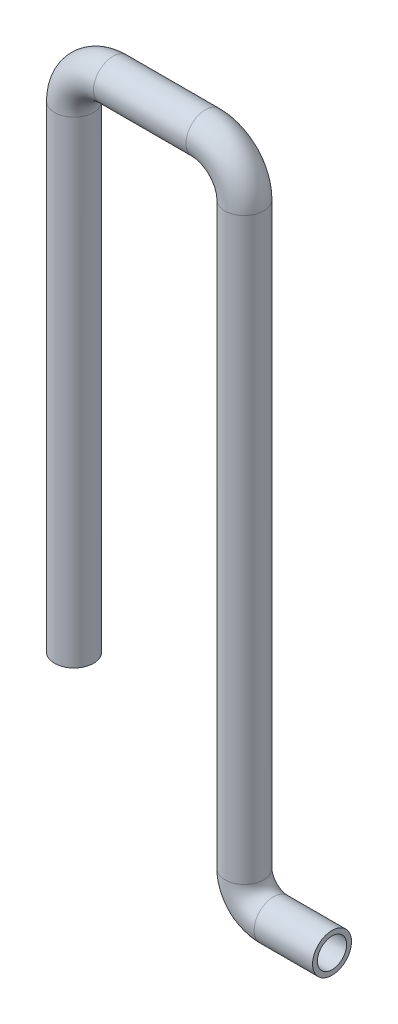
ISO-10303-21;
HEADER;
FILE_DESCRIPTION(('STEP AP214'),'2;1');
FILE_NAME('part.step','',(''),(''),'','','');
FILE_SCHEMA(('AUTOMOTIVE_DESIGN { 1 0 10303 214 1 1 1 1 }'));
ENDSEC;
DATA;
#1=APPLICATION_CONTEXT('core data for automotive mechanical design processes');
#2=APPLICATION_PROTOCOL_DEFINITION('international standard','automotive_design',2000,#1);
#3=PRODUCT_CONTEXT('',#1,'mechanical');
#4=PRODUCT('Part','Part','',(#3));
#5=PRODUCT_RELATED_PRODUCT_CATEGORY('part','',(#4));
#6=PRODUCT_DEFINITION_FORMATION('','',#4);
#7=PRODUCT_DEFINITION_CONTEXT('part definition',#1,'design');
#8=PRODUCT_DEFINITION('design','',#6,#7);
#9=PRODUCT_DEFINITION_SHAPE('','',#8);
#10=(LENGTH_UNIT() NAMED_UNIT(*) SI_UNIT(.MILLI.,.METRE.));
#11=(NAMED_UNIT(*) PLANE_ANGLE_UNIT() SI_UNIT($,.RADIAN.));
#12=(NAMED_UNIT(*) SI_UNIT($,.STERADIAN.) SOLID_ANGLE_UNIT());
#13=UNCERTAINTY_MEASURE_WITH_UNIT(LENGTH_MEASURE(1.E-05),#10,'distance_accuracy_value','');
#14=(GEOMETRIC_REPRESENTATION_CONTEXT(3) GLOBAL_UNCERTAINTY_ASSIGNED_CONTEXT((#13)) GLOBAL_UNIT_ASSIGNED_CONTEXT((#10,
#11,#12)) REPRESENTATION_CONTEXT('',''));
#15=CARTESIAN_POINT('',(0.,0.,0.));
#16=DIRECTION('',(0.,0.,1.));
#17=DIRECTION('',(1.,0.,0.));
#18=AXIS2_PLACEMENT_3D('',#15,#16,#17);
#19=CARTESIAN_POINT('',(-145.,44.,95.));
#20=DIRECTION('',(0.,-1.,0.));
#21=DIRECTION('',(0.,0.,1.));
#22=AXIS2_PLACEMENT_3D('',#19,#20,#21);
#23=PLANE('',#22);
#24=CARTESIAN_POINT('',(-145.,44.,95.));
#25=DIRECTION('',(0.,-1.,0.));
#26=DIRECTION('',(0.,0.,1.));
#27=AXIS2_PLACEMENT_3D('',#24,#25,#26);
#28=CIRCLE('',#27,3.);
#29=CARTESIAN_POINT('',(-145.,44.,98.));
#30=VERTEX_POINT('',#29);
#31=EDGE_CURVE('E263',#30,#30,#28,.T.);
#32=ORIENTED_EDGE('',*,*,#31,.F.);
#33=EDGE_LOOP('',(#32));
#34=FACE_BOUND('',#33,.T.);
#35=CARTESIAN_POINT('',(-145.,44.,95.));
#36=DIRECTION('',(0.,-1.,0.));
#37=DIRECTION('',(0.,0.,-1.));
#38=AXIS2_PLACEMENT_3D('',#35,#36,#37);
#39=CIRCLE('',#38,4.);
#40=CARTESIAN_POINT('',(-145.,44.,91.));
#41=VERTEX_POINT('',#40);
#42=EDGE_CURVE('E75',#41,#41,#39,.T.);
#43=ORIENTED_EDGE('',*,*,#42,.T.);
#44=EDGE_LOOP('',(#43));
#45=FACE_BOUND('',#44,.T.);
#46=ADVANCED_FACE('F52',(#34,#45),#23,.T.);
#47=CARTESIAN_POINT('',(-92.,17.,95.));
#48=DIRECTION('',(-1.,0.,0.));
#49=DIRECTION('',(0.,0.,1.));
#50=AXIS2_PLACEMENT_3D('',#47,#48,#49);
#51=PLANE('',#50);
#52=CARTESIAN_POINT('',(-92.,17.,95.));
#53=DIRECTION('',(-1.,0.,0.));
#54=DIRECTION('',(0.,0.,1.));
#55=AXIS2_PLACEMENT_3D('',#52,#53,#54);
#56=CIRCLE('',#55,3.);
#57=CARTESIAN_POINT('',(-92.,17.,98.));
#58=VERTEX_POINT('',#57);
#59=EDGE_CURVE('E73',#58,#58,#56,.T.);
#60=ORIENTED_EDGE('',*,*,#59,.T.);
#61=EDGE_LOOP('',(#60));
#62=FACE_BOUND('',#61,.T.);
#63=CARTESIAN_POINT('',(-92.,17.,95.));
#64=DIRECTION('',(-1.,0.,0.));
#65=DIRECTION('',(0.,0.,1.));
#66=AXIS2_PLACEMENT_3D('',#63,#64,#65);
#67=CIRCLE('',#66,4.);
#68=CARTESIAN_POINT('',(-92.,17.,99.));
#69=VERTEX_POINT('',#68);
#70=EDGE_CURVE('E11',#69,#69,#67,.T.);
#71=ORIENTED_EDGE('',*,*,#70,.F.);
#72=EDGE_LOOP('',(#71));
#73=FACE_BOUND('',#72,.T.);
#74=ADVANCED_FACE('F149',(#62,#73),#51,.F.);
#75=CARTESIAN_POINT('',(-145.,44.,95.));
#76=DIRECTION('',(0.,1.,0.));
#77=DIRECTION('',(0.,0.,1.));
#78=AXIS2_PLACEMENT_3D('',#75,#76,#77);
#79=CYLINDRICAL_SURFACE('',#78,4.);
#80=CARTESIAN_POINT('',(-145.,142.,95.));
#81=DIRECTION('',(0.,1.,0.));
#82=DIRECTION('',(0.,0.,1.));
#83=AXIS2_PLACEMENT_3D('',#80,#81,#82);
#84=CIRCLE('',#83,4.);
#85=CARTESIAN_POINT('',(-149.,142.,95.));
#86=VERTEX_POINT('',#85);
#87=EDGE_CURVE('E74',#86,#86,#84,.F.);
#88=ORIENTED_EDGE('',*,*,#87,.T.);
#89=EDGE_LOOP('',(#88));
#90=FACE_BOUND('',#89,.T.);
#91=ORIENTED_EDGE('',*,*,#42,.F.);
#92=EDGE_LOOP('',(#91));
#93=FACE_BOUND('',#92,.T.);
#94=ADVANCED_FACE('F155',(#90,#93),#79,.T.);
#95=CARTESIAN_POINT('',(-137.,142.,95.));
#96=DIRECTION('',(0.,0.,-1.));
#97=DIRECTION('',(-1.,0.,0.));
#98=AXIS2_PLACEMENT_3D('',#95,#96,#97);
#99=TOROIDAL_SURFACE('',#98,8.00000000000001,4.);
#100=CARTESIAN_POINT('',(-137.,150.,95.));
#101=DIRECTION('',(-1.,0.,0.));
#102=DIRECTION('',(0.,-1.,0.));
#103=AXIS2_PLACEMENT_3D('',#100,#101,#102);
#104=CIRCLE('',#103,4.);
#105=CARTESIAN_POINT('',(-137.,154.,95.));
#106=VERTEX_POINT('',#105);
#107=EDGE_CURVE('E78',#106,#106,#104,.T.);
#108=CARTESIAN_POINT('',(-137.,142.,95.));
#109=DIRECTION('',(0.,0.,-1.));
#110=DIRECTION('',(-1.,0.,0.));
#111=AXIS2_PLACEMENT_3D('',#108,#109,#110);
#112=CIRCLE('',#111,12.);
#113=EDGE_CURVE('',#86,#106,#112,.T.);
#114=ORIENTED_EDGE('',*,*,#87,.F.);
#115=ORIENTED_EDGE('',*,*,#107,.T.);
#116=ORIENTED_EDGE('',*,*,#113,.T.);
#117=ORIENTED_EDGE('',*,*,#113,.F.);
#118=EDGE_LOOP('',(#114,#116,#115,#117));
#119=FACE_BOUND('',#118,.T.);
#120=ADVANCED_FACE('F158',(#119),#99,.T.);
#121=CARTESIAN_POINT('',(-137.,150.,95.));
#122=DIRECTION('',(1.,0.,0.));
#123=DIRECTION('',(0.,0.,-1.));
#124=AXIS2_PLACEMENT_3D('',#121,#122,#123);
#125=CYLINDRICAL_SURFACE('',#124,4.);
#126=CARTESIAN_POINT('',(-118.,150.,95.));
#127=DIRECTION('',(1.,0.,0.));
#128=DIRECTION('',(0.,0.,-1.));
#129=AXIS2_PLACEMENT_3D('',#126,#127,#128);
#130=CIRCLE('',#129,4.);
#131=CARTESIAN_POINT('',(-118.,154.,95.));
#132=VERTEX_POINT('',#131);
#133=EDGE_CURVE('E91',#132,#132,#130,.F.);
#134=ORIENTED_EDGE('',*,*,#133,.T.);
#135=EDGE_LOOP('',(#134));
#136=FACE_BOUND('',#135,.T.);
#137=ORIENTED_EDGE('',*,*,#107,.F.);
#138=EDGE_LOOP('',(#137));
#139=FACE_BOUND('',#138,.T.);
#140=ADVANCED_FACE('F109',(#136,#139),#125,.T.);
#141=CARTESIAN_POINT('',(-118.,142.,95.));
#142=DIRECTION('',(0.,0.,-1.));
#143=DIRECTION('',(-1.,0.,0.));
#144=AXIS2_PLACEMENT_3D('',#141,#142,#143);
#145=TOROIDAL_SURFACE('',#144,8.00000000000015,4.);
#146=CARTESIAN_POINT('',(-110.,142.,95.));
#147=DIRECTION('',(0.,1.,0.));
#148=DIRECTION('',(-1.,0.,0.));
#149=AXIS2_PLACEMENT_3D('',#146,#147,#148);
#150=CIRCLE('',#149,4.);
#151=CARTESIAN_POINT('',(-106.,142.,95.));
#152=VERTEX_POINT('',#151);
#153=EDGE_CURVE('E68',#152,#152,#150,.T.);
#154=CARTESIAN_POINT('',(-118.,142.,95.));
#155=DIRECTION('',(0.,0.,-1.));
#156=DIRECTION('',(-1.,0.,0.));
#157=AXIS2_PLACEMENT_3D('',#154,#155,#156);
#158=CIRCLE('',#157,12.0000000000001);
#159=EDGE_CURVE('',#132,#152,#158,.T.);
#160=ORIENTED_EDGE('',*,*,#133,.F.);
#161=ORIENTED_EDGE('',*,*,#153,.T.);
#162=ORIENTED_EDGE('',*,*,#159,.T.);
#163=ORIENTED_EDGE('',*,*,#159,.F.);
#164=EDGE_LOOP('',(#160,#162,#161,#163));
#165=FACE_BOUND('',#164,.T.);
#166=ADVANCED_FACE('F98',(#165),#145,.T.);
#167=CARTESIAN_POINT('',(-110.,142.,95.));
#168=DIRECTION('',(0.,-1.,0.));
#169=DIRECTION('',(0.,0.,-1.));
#170=AXIS2_PLACEMENT_3D('',#167,#168,#169);
#171=CYLINDRICAL_SURFACE('',#170,4.);
#172=CARTESIAN_POINT('',(-110.,23.,95.));
#173=DIRECTION('',(0.,-1.,0.));
#174=DIRECTION('',(0.,0.,-1.));
#175=AXIS2_PLACEMENT_3D('',#172,#173,#174);
#176=CIRCLE('',#175,4.);
#177=CARTESIAN_POINT('',(-114.,23.,95.));
#178=VERTEX_POINT('',#177);
#179=EDGE_CURVE('E63',#178,#178,#176,.F.);
#180=ORIENTED_EDGE('',*,*,#179,.T.);
#181=EDGE_LOOP('',(#180));
#182=FACE_BOUND('',#181,.T.);
#183=ORIENTED_EDGE('',*,*,#153,.F.);
#184=EDGE_LOOP('',(#183));
#185=FACE_BOUND('',#184,.T.);
#186=ADVANCED_FACE('F101',(#182,#185),#171,.T.);
#187=CARTESIAN_POINT('',(-104.,23.,95.));
#188=DIRECTION('',(0.,0.,1.));
#189=DIRECTION('',(1.,0.,0.));
#190=AXIS2_PLACEMENT_3D('',#187,#188,#189);
#191=TOROIDAL_SURFACE('',#190,6.00000000000002,4.);
#192=CARTESIAN_POINT('',(-104.,17.,95.));
#193=DIRECTION('',(-1.,0.,0.));
#194=DIRECTION('',(0.,-1.,0.));
#195=AXIS2_PLACEMENT_3D('',#192,#193,#194);
#196=CIRCLE('',#195,4.);
#197=CARTESIAN_POINT('',(-104.,13.,95.));
#198=VERTEX_POINT('',#197);
#199=EDGE_CURVE('E58',#198,#198,#196,.T.);
#200=CARTESIAN_POINT('',(-104.,23.,95.));
#201=DIRECTION('',(0.,0.,1.));
#202=DIRECTION('',(1.,0.,0.));
#203=AXIS2_PLACEMENT_3D('',#200,#201,#202);
#204=CIRCLE('',#203,10.);
#205=EDGE_CURVE('',#178,#198,#204,.T.);
#206=ORIENTED_EDGE('',*,*,#179,.F.);
#207=ORIENTED_EDGE('',*,*,#199,.T.);
#208=ORIENTED_EDGE('',*,*,#205,.T.);
#209=ORIENTED_EDGE('',*,*,#205,.F.);
#210=EDGE_LOOP('',(#206,#208,#207,#209));
#211=FACE_BOUND('',#210,.T.);
#212=ADVANCED_FACE('F103',(#211),#191,.T.);
#213=CARTESIAN_POINT('',(-104.,17.,95.));
#214=DIRECTION('',(1.,0.,0.));
#215=DIRECTION('',(0.,0.,-1.));
#216=AXIS2_PLACEMENT_3D('',#213,#214,#215);
#217=CYLINDRICAL_SURFACE('',#216,4.);
#218=ORIENTED_EDGE('',*,*,#70,.T.);
#219=EDGE_LOOP('',(#218));
#220=FACE_BOUND('',#219,.T.);
#221=ORIENTED_EDGE('',*,*,#199,.F.);
#222=EDGE_LOOP('',(#221));
#223=FACE_BOUND('',#222,.T.);
#224=ADVANCED_FACE('F54',(#220,#223),#217,.T.);
#225=CARTESIAN_POINT('',(-145.,44.,95.));
#226=DIRECTION('',(0.,1.,0.));
#227=DIRECTION('',(0.,0.,1.));
#228=AXIS2_PLACEMENT_3D('',#225,#226,#227);
#229=CYLINDRICAL_SURFACE('',#228,3.);
#230=CARTESIAN_POINT('',(-145.,142.,95.));
#231=DIRECTION('',(0.,-1.,0.));
#232=DIRECTION('',(0.,0.,1.));
#233=AXIS2_PLACEMENT_3D('',#230,#231,#232);
#234=CIRCLE('',#233,3.);
#235=CARTESIAN_POINT('',(-148.,142.,95.));
#236=VERTEX_POINT('',#235);
#237=EDGE_CURVE('E262',#236,#236,#234,.T.);
#238=ORIENTED_EDGE('',*,*,#237,.F.);
#239=EDGE_LOOP('',(#238));
#240=FACE_BOUND('',#239,.T.);
#241=ORIENTED_EDGE('',*,*,#31,.T.);
#242=EDGE_LOOP('',(#241));
#243=FACE_BOUND('',#242,.T.);
#244=ADVANCED_FACE('F114',(#240,#243),#229,.F.);
#245=CARTESIAN_POINT('',(-137.,142.,95.));
#246=DIRECTION('',(0.,0.,-1.));
#247=DIRECTION('',(-1.,0.,0.));
#248=AXIS2_PLACEMENT_3D('',#245,#246,#247);
#249=TOROIDAL_SURFACE('',#248,8.00000000000001,3.);
#250=CARTESIAN_POINT('',(-137.,150.,95.));
#251=DIRECTION('',(-1.,0.,0.));
#252=DIRECTION('',(0.,0.,1.));
#253=AXIS2_PLACEMENT_3D('',#250,#251,#252);
#254=CIRCLE('',#253,3.);
#255=CARTESIAN_POINT('',(-137.,153.,95.));
#256=VERTEX_POINT('',#255);
#257=EDGE_CURVE('E270',#256,#256,#254,.T.);
#258=CARTESIAN_POINT('',(-137.,142.,95.));
#259=DIRECTION('',(0.,0.,-1.));
#260=DIRECTION('',(-1.,0.,0.));
#261=AXIS2_PLACEMENT_3D('',#258,#259,#260);
#262=CIRCLE('',#261,11.);
#263=EDGE_CURVE('',#236,#256,#262,.T.);
#264=ORIENTED_EDGE('',*,*,#237,.T.);
#265=ORIENTED_EDGE('',*,*,#257,.F.);
#266=ORIENTED_EDGE('',*,*,#263,.T.);
#267=ORIENTED_EDGE('',*,*,#263,.F.);
#268=EDGE_LOOP('',(#264,#266,#265,#267));
#269=FACE_BOUND('',#268,.T.);
#270=ADVANCED_FACE('F116',(#269),#249,.F.);
#271=CARTESIAN_POINT('',(-137.,150.,95.));
#272=DIRECTION('',(1.,0.,0.));
#273=DIRECTION('',(0.,0.,-1.));
#274=AXIS2_PLACEMENT_3D('',#271,#272,#273);
#275=CYLINDRICAL_SURFACE('',#274,3.);
#276=CARTESIAN_POINT('',(-118.,150.,95.));
#277=DIRECTION('',(-1.,0.,0.));
#278=DIRECTION('',(0.,0.,1.));
#279=AXIS2_PLACEMENT_3D('',#276,#277,#278);
#280=CIRCLE('',#279,3.);
#281=CARTESIAN_POINT('',(-118.,153.,95.));
#282=VERTEX_POINT('',#281);
#283=EDGE_CURVE('E275',#282,#282,#280,.T.);
#284=ORIENTED_EDGE('',*,*,#283,.F.);
#285=EDGE_LOOP('',(#284));
#286=FACE_BOUND('',#285,.T.);
#287=ORIENTED_EDGE('',*,*,#257,.T.);
#288=EDGE_LOOP('',(#287));
#289=FACE_BOUND('',#288,.T.);
#290=ADVANCED_FACE('F123',(#286,#289),#275,.F.);
#291=CARTESIAN_POINT('',(-118.,142.,95.));
#292=DIRECTION('',(0.,0.,-1.));
#293=DIRECTION('',(-1.,0.,0.));
#294=AXIS2_PLACEMENT_3D('',#291,#292,#293);
#295=TOROIDAL_SURFACE('',#294,8.00000000000015,3.);
#296=CARTESIAN_POINT('',(-110.,142.,95.));
#297=DIRECTION('',(0.,1.,0.));
#298=DIRECTION('',(0.,0.,1.));
#299=AXIS2_PLACEMENT_3D('',#296,#297,#298);
#300=CIRCLE('',#299,3.);
#301=CARTESIAN_POINT('',(-107.,142.,95.));
#302=VERTEX_POINT('',#301);
#303=EDGE_CURVE('E274',#302,#302,#300,.T.);
#304=CARTESIAN_POINT('',(-118.,142.,95.));
#305=DIRECTION('',(0.,0.,-1.));
#306=DIRECTION('',(-1.,0.,0.));
#307=AXIS2_PLACEMENT_3D('',#304,#305,#306);
#308=CIRCLE('',#307,11.0000000000001);
#309=EDGE_CURVE('',#282,#302,#308,.T.);
#310=ORIENTED_EDGE('',*,*,#283,.T.);
#311=ORIENTED_EDGE('',*,*,#303,.F.);
#312=ORIENTED_EDGE('',*,*,#309,.T.);
#313=ORIENTED_EDGE('',*,*,#309,.F.);
#314=EDGE_LOOP('',(#310,#312,#311,#313));
#315=FACE_BOUND('',#314,.T.);
#316=ADVANCED_FACE('F131',(#315),#295,.F.);
#317=CARTESIAN_POINT('',(-110.,142.,95.));
#318=DIRECTION('',(0.,-1.,0.));
#319=DIRECTION('',(0.,0.,-1.));
#320=AXIS2_PLACEMENT_3D('',#317,#318,#319);
#321=CYLINDRICAL_SURFACE('',#320,3.);
#322=CARTESIAN_POINT('',(-110.,23.,95.));
#323=DIRECTION('',(0.,1.,0.));
#324=DIRECTION('',(0.,0.,1.));
#325=AXIS2_PLACEMENT_3D('',#322,#323,#324);
#326=CIRCLE('',#325,3.);
#327=CARTESIAN_POINT('',(-113.,23.,95.));
#328=VERTEX_POINT('',#327);
#329=EDGE_CURVE('E87',#328,#328,#326,.T.);
#330=ORIENTED_EDGE('',*,*,#329,.F.);
#331=EDGE_LOOP('',(#330));
#332=FACE_BOUND('',#331,.T.);
#333=ORIENTED_EDGE('',*,*,#303,.T.);
#334=EDGE_LOOP('',(#333));
#335=FACE_BOUND('',#334,.T.);
#336=ADVANCED_FACE('F136',(#332,#335),#321,.F.);
#337=CARTESIAN_POINT('',(-104.,23.,95.));
#338=DIRECTION('',(0.,0.,1.));
#339=DIRECTION('',(1.,0.,0.));
#340=AXIS2_PLACEMENT_3D('',#337,#338,#339);
#341=TOROIDAL_SURFACE('',#340,6.00000000000002,3.);
#342=CARTESIAN_POINT('',(-104.,17.,95.));
#343=DIRECTION('',(-1.,0.,0.));
#344=DIRECTION('',(0.,0.,1.));
#345=AXIS2_PLACEMENT_3D('',#342,#343,#344);
#346=CIRCLE('',#345,3.);
#347=CARTESIAN_POINT('',(-104.,14.,95.));
#348=VERTEX_POINT('',#347);
#349=EDGE_CURVE('E85',#348,#348,#346,.T.);
#350=CARTESIAN_POINT('',(-104.,23.,95.));
#351=DIRECTION('',(0.,0.,1.));
#352=DIRECTION('',(1.,0.,0.));
#353=AXIS2_PLACEMENT_3D('',#350,#351,#352);
#354=CIRCLE('',#353,9.00000000000002);
#355=EDGE_CURVE('',#328,#348,#354,.T.);
#356=ORIENTED_EDGE('',*,*,#329,.T.);
#357=ORIENTED_EDGE('',*,*,#349,.F.);
#358=ORIENTED_EDGE('',*,*,#355,.T.);
#359=ORIENTED_EDGE('',*,*,#355,.F.);
#360=EDGE_LOOP('',(#356,#358,#357,#359));
#361=FACE_BOUND('',#360,.T.);
#362=ADVANCED_FACE('F139',(#361),#341,.F.);
#363=CARTESIAN_POINT('',(-104.,17.,95.));
#364=DIRECTION('',(1.,0.,0.));
#365=DIRECTION('',(0.,0.,-1.));
#366=AXIS2_PLACEMENT_3D('',#363,#364,#365);
#367=CYLINDRICAL_SURFACE('',#366,3.);
#368=ORIENTED_EDGE('',*,*,#59,.F.);
#369=EDGE_LOOP('',(#368));
#370=FACE_BOUND('',#369,.T.);
#371=ORIENTED_EDGE('',*,*,#349,.T.);
#372=EDGE_LOOP('',(#371));
#373=FACE_BOUND('',#372,.T.);
#374=ADVANCED_FACE('F145',(#370,#373),#367,.F.);
#375=CLOSED_SHELL('',(#46,#74,#94,#120,#140,#166,#186,#212,#224,#244,#270,#290,#316,#336,#362,#374));
#376=MANIFOLD_SOLID_BREP('B2',#375);
#377=ADVANCED_BREP_SHAPE_REPRESENTATION('',(#18,#376),#14);
#378=SHAPE_DEFINITION_REPRESENTATION(#9,#377);
ENDSEC;
END-ISO-10303-21;
